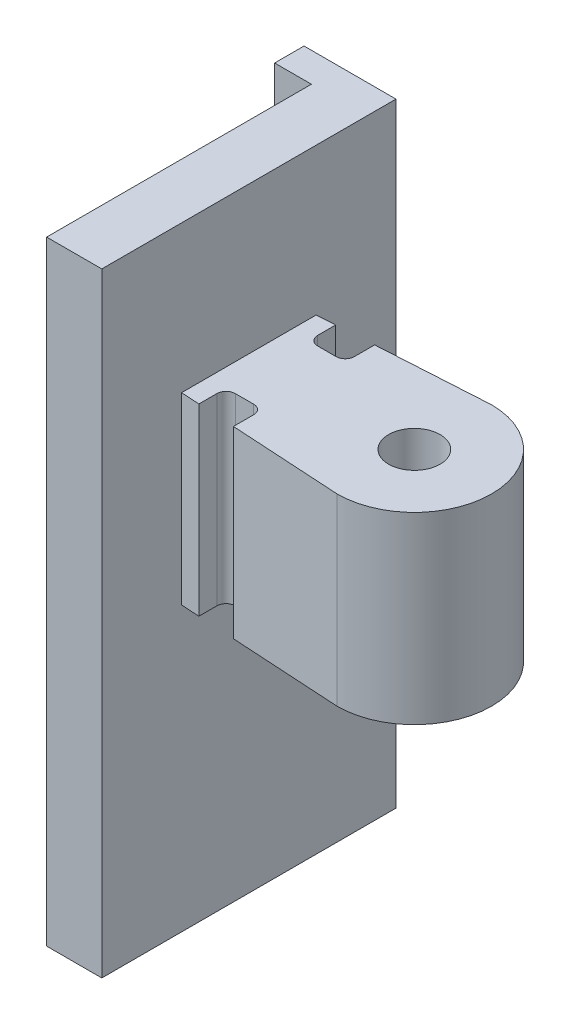
ISO-10303-21;
HEADER;
FILE_DESCRIPTION(('STEP AP214'),'2;1');
FILE_NAME('part.step','',(''),(''),'','','');
FILE_SCHEMA(('AUTOMOTIVE_DESIGN { 1 0 10303 214 1 1 1 1 }'));
ENDSEC;
DATA;
#1=APPLICATION_CONTEXT('core data for automotive mechanical design processes');
#2=APPLICATION_PROTOCOL_DEFINITION('international standard','automotive_design',2000,#1);
#3=PRODUCT_CONTEXT('',#1,'mechanical');
#4=PRODUCT('Part','Part','',(#3));
#5=PRODUCT_RELATED_PRODUCT_CATEGORY('part','',(#4));
#6=PRODUCT_DEFINITION_FORMATION('','',#4);
#7=PRODUCT_DEFINITION_CONTEXT('part definition',#1,'design');
#8=PRODUCT_DEFINITION('design','',#6,#7);
#9=PRODUCT_DEFINITION_SHAPE('','',#8);
#10=(LENGTH_UNIT() NAMED_UNIT(*) SI_UNIT(.MILLI.,.METRE.));
#11=(NAMED_UNIT(*) PLANE_ANGLE_UNIT() SI_UNIT($,.RADIAN.));
#12=(NAMED_UNIT(*) SI_UNIT($,.STERADIAN.) SOLID_ANGLE_UNIT());
#13=UNCERTAINTY_MEASURE_WITH_UNIT(LENGTH_MEASURE(1.E-05),#10,'distance_accuracy_value','');
#14=(GEOMETRIC_REPRESENTATION_CONTEXT(3) GLOBAL_UNCERTAINTY_ASSIGNED_CONTEXT((#13)) GLOBAL_UNIT_ASSIGNED_CONTEXT((#10,
#11,#12)) REPRESENTATION_CONTEXT('',''));
#15=CARTESIAN_POINT('',(0.,0.,0.));
#16=DIRECTION('',(0.,0.,1.));
#17=DIRECTION('',(1.,0.,0.));
#18=AXIS2_PLACEMENT_3D('',#15,#16,#17);
#19=CARTESIAN_POINT('',(-2.25000000000002,0.,0.));
#20=DIRECTION('',(-1.,0.,0.));
#21=DIRECTION('',(0.,0.,1.));
#22=AXIS2_PLACEMENT_3D('',#19,#20,#21);
#23=PLANE('',#22);
#24=DIRECTION('',(0.,-1.,0.));
#25=VECTOR('',#24,1.);
#26=CARTESIAN_POINT('',(-2.25000000000002,4.5,-2.));
#27=LINE('',#26,#25);
#28=CARTESIAN_POINT('',(-2.25000000000002,4.5,-2.));
#29=VERTEX_POINT('',#28);
#30=CARTESIAN_POINT('',(-2.25000000000002,-3.85,-2.));
#31=VERTEX_POINT('',#30);
#32=EDGE_CURVE('E191',#29,#31,#27,.T.);
#33=ORIENTED_EDGE('',*,*,#32,.F.);
#34=DIRECTION('',(0.,0.,-1.));
#35=VECTOR('',#34,1.);
#36=CARTESIAN_POINT('',(-2.25000000000002,4.5,-2.));
#37=LINE('',#36,#35);
#38=CARTESIAN_POINT('',(-2.25000000000002,4.5,2.));
#39=VERTEX_POINT('',#38);
#40=EDGE_CURVE('E196',#39,#29,#37,.T.);
#41=ORIENTED_EDGE('',*,*,#40,.F.);
#42=DIRECTION('',(0.,1.,0.));
#43=VECTOR('',#42,1.);
#44=CARTESIAN_POINT('',(-2.25000000000002,4.5,2.));
#45=LINE('',#44,#43);
#46=CARTESIAN_POINT('',(-2.25000000000002,-3.85,2.));
#47=VERTEX_POINT('',#46);
#48=EDGE_CURVE('E231',#47,#39,#45,.T.);
#49=ORIENTED_EDGE('',*,*,#48,.F.);
#50=DIRECTION('',(0.,0.,1.));
#51=VECTOR('',#50,1.);
#52=CARTESIAN_POINT('',(-2.25000000000002,-3.85,-2.));
#53=LINE('',#52,#51);
#54=EDGE_CURVE('E229',#31,#47,#53,.T.);
#55=ORIENTED_EDGE('',*,*,#54,.F.);
#56=EDGE_LOOP('',(#33,#41,#49,#55));
#57=FACE_BOUND('',#56,.T.);
#58=DIRECTION('',(0.,1.,0.));
#59=VECTOR('',#58,1.);
#60=CARTESIAN_POINT('',(-2.25000000000002,2.5,0.915));
#61=LINE('',#60,#59);
#62=CARTESIAN_POINT('',(-2.25000000000002,0.,0.915));
#63=VERTEX_POINT('',#62);
#64=CARTESIAN_POINT('',(-2.25000000000002,2.5,0.915));
#65=VERTEX_POINT('',#64);
#66=EDGE_CURVE('E242',#63,#65,#61,.T.);
#67=ORIENTED_EDGE('',*,*,#66,.T.);
#68=DIRECTION('',(0.,0.,-1.));
#69=VECTOR('',#68,1.);
#70=CARTESIAN_POINT('',(-2.25000000000002,2.5,0.));
#71=LINE('',#70,#69);
#72=CARTESIAN_POINT('',(-2.25000000000002,2.5,-0.915));
#73=VERTEX_POINT('',#72);
#74=EDGE_CURVE('E244',#65,#73,#71,.T.);
#75=ORIENTED_EDGE('',*,*,#74,.T.);
#76=DIRECTION('',(0.,1.,0.));
#77=VECTOR('',#76,1.);
#78=CARTESIAN_POINT('',(-2.25000000000002,2.5,-0.915));
#79=LINE('',#78,#77);
#80=CARTESIAN_POINT('',(-2.25000000000002,0.,-0.915));
#81=VERTEX_POINT('',#80);
#82=EDGE_CURVE('E60',#81,#73,#79,.T.);
#83=ORIENTED_EDGE('',*,*,#82,.F.);
#84=DIRECTION('',(0.,0.,-1.));
#85=VECTOR('',#84,1.);
#86=CARTESIAN_POINT('',(-2.25000000000002,0.,0.));
#87=LINE('',#86,#85);
#88=EDGE_CURVE('E11',#63,#81,#87,.T.);
#89=ORIENTED_EDGE('',*,*,#88,.F.);
#90=EDGE_LOOP('',(#67,#75,#83,#89));
#91=FACE_BOUND('',#90,.T.);
#92=ADVANCED_FACE('F37',(#57,#91),#23,.F.);
#93=CARTESIAN_POINT('',(-2.25000000000002,4.5,-2.));
#94=DIRECTION('',(0.,0.,-1.));
#95=DIRECTION('',(0.,1.,0.));
#96=AXIS2_PLACEMENT_3D('',#93,#94,#95);
#97=PLANE('',#96);
#98=DIRECTION('',(-1.,0.,0.));
#99=VECTOR('',#98,1.);
#100=CARTESIAN_POINT('',(-2.25000000000002,-3.85,-2.));
#101=LINE('',#100,#99);
#102=CARTESIAN_POINT('',(-3.50000000000002,-3.85,-2.));
#103=VERTEX_POINT('',#102);
#104=EDGE_CURVE('E185',#31,#103,#101,.T.);
#105=ORIENTED_EDGE('',*,*,#104,.T.);
#106=DIRECTION('',(0.,-1.,0.));
#107=VECTOR('',#106,1.);
#108=CARTESIAN_POINT('',(-3.50000000000002,-3.85,-2.));
#109=LINE('',#108,#107);
#110=CARTESIAN_POINT('',(-3.50000000000002,4.5,-2.));
#111=VERTEX_POINT('',#110);
#112=EDGE_CURVE('E189',#111,#103,#109,.T.);
#113=ORIENTED_EDGE('',*,*,#112,.F.);
#114=DIRECTION('',(-1.,0.,0.));
#115=VECTOR('',#114,1.);
#116=CARTESIAN_POINT('',(-2.25000000000002,4.5,-2.));
#117=LINE('',#116,#115);
#118=EDGE_CURVE('E236',#29,#111,#117,.T.);
#119=ORIENTED_EDGE('',*,*,#118,.F.);
#120=ORIENTED_EDGE('',*,*,#32,.T.);
#121=EDGE_LOOP('',(#105,#113,#119,#120));
#122=FACE_BOUND('',#121,.T.);
#123=ADVANCED_FACE('F187',(#122),#97,.T.);
#124=CARTESIAN_POINT('',(-2.25000000000002,4.5,-2.));
#125=DIRECTION('',(0.,1.,0.));
#126=DIRECTION('',(0.,0.,1.));
#127=AXIS2_PLACEMENT_3D('',#124,#125,#126);
#128=PLANE('',#127);
#129=ORIENTED_EDGE('',*,*,#118,.T.);
#130=DIRECTION('',(0.,0.,-1.));
#131=VECTOR('',#130,1.);
#132=CARTESIAN_POINT('',(-3.50000000000002,4.5,-2.));
#133=LINE('',#132,#131);
#134=CARTESIAN_POINT('',(-3.50000000000002,4.5,-1.6));
#135=VERTEX_POINT('',#134);
#136=EDGE_CURVE('E211',#135,#111,#133,.T.);
#137=ORIENTED_EDGE('',*,*,#136,.F.);
#138=DIRECTION('',(1.,0.,0.));
#139=VECTOR('',#138,1.);
#140=CARTESIAN_POINT('',(-3.50000000000002,4.5,-1.6));
#141=LINE('',#140,#139);
#142=CARTESIAN_POINT('',(-3.00000000000002,4.5,-1.6));
#143=VERTEX_POINT('',#142);
#144=EDGE_CURVE('E216',#135,#143,#141,.T.);
#145=ORIENTED_EDGE('',*,*,#144,.T.);
#146=DIRECTION('',(0.,0.,-1.));
#147=VECTOR('',#146,1.);
#148=CARTESIAN_POINT('',(-3.00000000000002,4.5,-2.));
#149=LINE('',#148,#147);
#150=CARTESIAN_POINT('',(-3.00000000000002,4.5,2.));
#151=VERTEX_POINT('',#150);
#152=EDGE_CURVE('E226',#151,#143,#149,.T.);
#153=ORIENTED_EDGE('',*,*,#152,.F.);
#154=DIRECTION('',(-1.,0.,0.));
#155=VECTOR('',#154,1.);
#156=CARTESIAN_POINT('',(-2.25000000000002,4.5,2.));
#157=LINE('',#156,#155);
#158=EDGE_CURVE('E238',#39,#151,#157,.T.);
#159=ORIENTED_EDGE('',*,*,#158,.F.);
#160=ORIENTED_EDGE('',*,*,#40,.T.);
#161=EDGE_LOOP('',(#129,#137,#145,#153,#159,#160));
#162=FACE_BOUND('',#161,.T.);
#163=ADVANCED_FACE('F438',(#162),#128,.T.);
#164=CARTESIAN_POINT('',(-2.25000000000002,4.5,2.));
#165=DIRECTION('',(0.,0.,1.));
#166=DIRECTION('',(0.,-1.,0.));
#167=AXIS2_PLACEMENT_3D('',#164,#165,#166);
#168=PLANE('',#167);
#169=ORIENTED_EDGE('',*,*,#158,.T.);
#170=DIRECTION('',(0.,1.,0.));
#171=VECTOR('',#170,1.);
#172=CARTESIAN_POINT('',(-3.00000000000002,4.5,2.));
#173=LINE('',#172,#171);
#174=CARTESIAN_POINT('',(-3.00000000000002,-3.85,2.));
#175=VERTEX_POINT('',#174);
#176=EDGE_CURVE('E223',#175,#151,#173,.T.);
#177=ORIENTED_EDGE('',*,*,#176,.F.);
#178=DIRECTION('',(-1.,0.,0.));
#179=VECTOR('',#178,1.);
#180=CARTESIAN_POINT('',(-2.25000000000002,-3.85,2.));
#181=LINE('',#180,#179);
#182=EDGE_CURVE('E195',#47,#175,#181,.T.);
#183=ORIENTED_EDGE('',*,*,#182,.F.);
#184=ORIENTED_EDGE('',*,*,#48,.T.);
#185=EDGE_LOOP('',(#169,#177,#183,#184));
#186=FACE_BOUND('',#185,.T.);
#187=ADVANCED_FACE('F446',(#186),#168,.T.);
#188=CARTESIAN_POINT('',(-2.25000000000002,-3.85,-2.));
#189=DIRECTION('',(0.,-1.,0.));
#190=DIRECTION('',(0.,0.,-1.));
#191=AXIS2_PLACEMENT_3D('',#188,#189,#190);
#192=PLANE('',#191);
#193=ORIENTED_EDGE('',*,*,#182,.T.);
#194=DIRECTION('',(0.,0.,1.));
#195=VECTOR('',#194,1.);
#196=CARTESIAN_POINT('',(-3.00000000000002,-3.85,-2.));
#197=LINE('',#196,#195);
#198=CARTESIAN_POINT('',(-3.00000000000002,-3.85,-1.6));
#199=VERTEX_POINT('',#198);
#200=EDGE_CURVE('E221',#199,#175,#197,.T.);
#201=ORIENTED_EDGE('',*,*,#200,.F.);
#202=DIRECTION('',(1.,0.,0.));
#203=VECTOR('',#202,1.);
#204=CARTESIAN_POINT('',(-3.50000000000002,-3.85,-1.6));
#205=LINE('',#204,#203);
#206=CARTESIAN_POINT('',(-3.50000000000002,-3.85,-1.6));
#207=VERTEX_POINT('',#206);
#208=EDGE_CURVE('E203',#207,#199,#205,.T.);
#209=ORIENTED_EDGE('',*,*,#208,.F.);
#210=DIRECTION('',(0.,0.,1.));
#211=VECTOR('',#210,1.);
#212=CARTESIAN_POINT('',(-3.50000000000002,-3.85,-1.6));
#213=LINE('',#212,#211);
#214=EDGE_CURVE('E199',#103,#207,#213,.T.);
#215=ORIENTED_EDGE('',*,*,#214,.F.);
#216=ORIENTED_EDGE('',*,*,#104,.F.);
#217=ORIENTED_EDGE('',*,*,#54,.T.);
#218=EDGE_LOOP('',(#193,#201,#209,#215,#216,#217));
#219=FACE_BOUND('',#218,.T.);
#220=ADVANCED_FACE('F201',(#219),#192,.T.);
#221=CARTESIAN_POINT('',(-3.00000000000002,0.,0.));
#222=DIRECTION('',(-1.,0.,0.));
#223=DIRECTION('',(0.,0.,1.));
#224=AXIS2_PLACEMENT_3D('',#221,#222,#223);
#225=PLANE('',#224);
#226=DIRECTION('',(0.,1.,0.));
#227=VECTOR('',#226,1.);
#228=CARTESIAN_POINT('',(-3.00000000000002,4.5,-1.6));
#229=LINE('',#228,#227);
#230=EDGE_CURVE('E52',#199,#143,#229,.T.);
#231=ORIENTED_EDGE('',*,*,#230,.F.);
#232=ORIENTED_EDGE('',*,*,#200,.T.);
#233=ORIENTED_EDGE('',*,*,#176,.T.);
#234=ORIENTED_EDGE('',*,*,#152,.T.);
#235=EDGE_LOOP('',(#231,#232,#233,#234));
#236=FACE_BOUND('',#235,.T.);
#237=ADVANCED_FACE('F442',(#236),#225,.T.);
#238=CARTESIAN_POINT('',(-2.50000000000002,2.5,0.9));
#239=DIRECTION('',(0.0598922907279451,0.,-0.998204845465779));
#240=DIRECTION('',(-0.998204845465779,0.,-0.0598922907279451));
#241=AXIS2_PLACEMENT_3D('',#238,#239,#240);
#242=PLANE('',#241);
#243=ORIENTED_EDGE('',*,*,#66,.F.);
#244=DIRECTION('',(0.998204845465779,0.,0.0598922907279451));
#245=VECTOR('',#244,1.);
#246=CARTESIAN_POINT('',(-2.50000000000002,0.,0.9));
#247=LINE('',#246,#245);
#248=CARTESIAN_POINT('',(-2.,0.,0.93));
#249=VERTEX_POINT('',#248);
#250=EDGE_CURVE('E250',#63,#249,#247,.T.);
#251=ORIENTED_EDGE('',*,*,#250,.T.);
#252=DIRECTION('',(0.,-1.,0.));
#253=VECTOR('',#252,1.);
#254=CARTESIAN_POINT('',(-2.,2.5,0.93));
#255=LINE('',#254,#253);
#256=CARTESIAN_POINT('',(-2.,2.5,0.93));
#257=VERTEX_POINT('',#256);
#258=EDGE_CURVE('E324',#257,#249,#255,.T.);
#259=ORIENTED_EDGE('',*,*,#258,.F.);
#260=DIRECTION('',(0.998204845465779,0.,0.0598922907279451));
#261=VECTOR('',#260,1.);
#262=CARTESIAN_POINT('',(-2.50000000000002,2.5,0.9));
#263=LINE('',#262,#261);
#264=EDGE_CURVE('E253',#65,#257,#263,.T.);
#265=ORIENTED_EDGE('',*,*,#264,.F.);
#266=EDGE_LOOP('',(#243,#251,#259,#265));
#267=FACE_BOUND('',#266,.T.);
#268=ADVANCED_FACE('F428',(#267),#242,.F.);
#269=CARTESIAN_POINT('',(-2.50000000000002,2.5,-0.9));
#270=DIRECTION('',(-0.0598922907279451,0.,-0.998204845465779));
#271=DIRECTION('',(-0.998204845465779,0.,0.0598922907279451));
#272=AXIS2_PLACEMENT_3D('',#269,#270,#271);
#273=PLANE('',#272);
#274=DIRECTION('',(0.998204845465779,0.,-0.0598922907279451));
#275=VECTOR('',#274,1.);
#276=CARTESIAN_POINT('',(-2.50000000000002,0.,-0.9));
#277=LINE('',#276,#275);
#278=CARTESIAN_POINT('',(-2.,0.,-0.93));
#279=VERTEX_POINT('',#278);
#280=EDGE_CURVE('E256',#81,#279,#277,.T.);
#281=ORIENTED_EDGE('',*,*,#280,.F.);
#282=ORIENTED_EDGE('',*,*,#82,.T.);
#283=DIRECTION('',(0.998204845465779,0.,-0.0598922907279451));
#284=VECTOR('',#283,1.);
#285=CARTESIAN_POINT('',(-2.50000000000002,2.5,-0.9));
#286=LINE('',#285,#284);
#287=CARTESIAN_POINT('',(-2.,2.5,-0.93));
#288=VERTEX_POINT('',#287);
#289=EDGE_CURVE('E282',#73,#288,#286,.T.);
#290=ORIENTED_EDGE('',*,*,#289,.T.);
#291=DIRECTION('',(0.,-1.,0.));
#292=VECTOR('',#291,1.);
#293=CARTESIAN_POINT('',(-2.,2.5,-0.93));
#294=LINE('',#293,#292);
#295=EDGE_CURVE('E284',#288,#279,#294,.T.);
#296=ORIENTED_EDGE('',*,*,#295,.T.);
#297=EDGE_LOOP('',(#281,#282,#290,#296));
#298=FACE_BOUND('',#297,.T.);
#299=ADVANCED_FACE('F431',(#298),#273,.T.);
#300=CARTESIAN_POINT('',(0.,2.5,0.));
#301=DIRECTION('',(0.,-1.,0.));
#302=DIRECTION('',(0.,0.,-1.));
#303=AXIS2_PLACEMENT_3D('',#300,#301,#302);
#304=PLANE('',#303);
#305=CARTESIAN_POINT('',(0.,2.5,0.));
#306=DIRECTION('',(0.,1.,0.));
#307=DIRECTION('',(0.,0.,1.));
#308=AXIS2_PLACEMENT_3D('',#305,#306,#307);
#309=CIRCLE('',#308,0.35);
#310=CARTESIAN_POINT('',(0.,2.5,0.35));
#311=VERTEX_POINT('',#310);
#312=EDGE_CURVE('E246',#311,#311,#309,.T.);
#313=ORIENTED_EDGE('',*,*,#312,.F.);
#314=EDGE_LOOP('',(#313));
#315=FACE_BOUND('',#314,.T.);
#316=ORIENTED_EDGE('',*,*,#74,.F.);
#317=ORIENTED_EDGE('',*,*,#264,.T.);
#318=DIRECTION('',(0.,0.,-1.));
#319=VECTOR('',#318,1.);
#320=CARTESIAN_POINT('',(-2.,2.5,0.93));
#321=LINE('',#320,#319);
#322=CARTESIAN_POINT('',(-2.,2.5,0.685));
#323=VERTEX_POINT('',#322);
#324=EDGE_CURVE('E255',#257,#323,#321,.T.);
#325=ORIENTED_EDGE('',*,*,#324,.T.);
#326=CARTESIAN_POINT('',(-1.875,2.5,0.685));
#327=DIRECTION('',(0.,-1.,0.));
#328=DIRECTION('',(0.,0.,-1.));
#329=AXIS2_PLACEMENT_3D('',#326,#327,#328);
#330=CIRCLE('',#329,0.125);
#331=CARTESIAN_POINT('',(-1.875,2.5,0.56));
#332=VERTEX_POINT('',#331);
#333=EDGE_CURVE('E349',#323,#332,#330,.T.);
#334=ORIENTED_EDGE('',*,*,#333,.T.);
#335=DIRECTION('',(-1.,0.,0.));
#336=VECTOR('',#335,1.);
#337=CARTESIAN_POINT('',(-1.5,2.5,0.56));
#338=LINE('',#337,#336);
#339=CARTESIAN_POINT('',(-1.625,2.5,0.56));
#340=VERTEX_POINT('',#339);
#341=EDGE_CURVE('E259',#340,#332,#338,.T.);
#342=ORIENTED_EDGE('',*,*,#341,.F.);
#343=CARTESIAN_POINT('',(-1.625,2.5,0.685));
#344=DIRECTION('',(0.,-1.,0.));
#345=DIRECTION('',(0.,0.,-1.));
#346=AXIS2_PLACEMENT_3D('',#343,#344,#345);
#347=CIRCLE('',#346,0.125);
#348=CARTESIAN_POINT('',(-1.5,2.5,0.685));
#349=VERTEX_POINT('',#348);
#350=EDGE_CURVE('E353',#340,#349,#347,.T.);
#351=ORIENTED_EDGE('',*,*,#350,.T.);
#352=DIRECTION('',(0.,0.,1.));
#353=VECTOR('',#352,1.);
#354=CARTESIAN_POINT('',(-1.5,2.5,0.56));
#355=LINE('',#354,#353);
#356=CARTESIAN_POINT('',(-1.5,2.5,0.96));
#357=VERTEX_POINT('',#356);
#358=EDGE_CURVE('E262',#349,#357,#355,.T.);
#359=ORIENTED_EDGE('',*,*,#358,.T.);
#360=DIRECTION('',(-0.998204845465779,0.,-0.0598922907279466));
#361=VECTOR('',#360,1.);
#362=CARTESIAN_POINT('',(0.,2.5,1.05));
#363=LINE('',#362,#361);
#364=CARTESIAN_POINT('',(0.,2.5,1.05));
#365=VERTEX_POINT('',#364);
#366=EDGE_CURVE('E264',#365,#357,#363,.T.);
#367=ORIENTED_EDGE('',*,*,#366,.F.);
#368=CARTESIAN_POINT('',(0.,2.5,0.));
#369=DIRECTION('',(0.,-1.,0.));
#370=DIRECTION('',(0.,0.,-1.));
#371=AXIS2_PLACEMENT_3D('',#368,#369,#370);
#372=CIRCLE('',#371,1.05);
#373=CARTESIAN_POINT('',(0.,2.5,-1.05));
#374=VERTEX_POINT('',#373);
#375=EDGE_CURVE('E267',#374,#365,#372,.T.);
#376=ORIENTED_EDGE('',*,*,#375,.F.);
#377=DIRECTION('',(0.998204845465779,0.,-0.0598922907279466));
#378=VECTOR('',#377,1.);
#379=CARTESIAN_POINT('',(-1.5,2.5,-0.96));
#380=LINE('',#379,#378);
#381=CARTESIAN_POINT('',(-1.5,2.5,-0.96));
#382=VERTEX_POINT('',#381);
#383=EDGE_CURVE('E270',#382,#374,#380,.T.);
#384=ORIENTED_EDGE('',*,*,#383,.F.);
#385=DIRECTION('',(0.,0.,1.));
#386=VECTOR('',#385,1.);
#387=CARTESIAN_POINT('',(-1.5,2.5,-0.96));
#388=LINE('',#387,#386);
#389=CARTESIAN_POINT('',(-1.5,2.5,-0.685));
#390=VERTEX_POINT('',#389);
#391=EDGE_CURVE('E273',#382,#390,#388,.T.);
#392=ORIENTED_EDGE('',*,*,#391,.T.);
#393=CARTESIAN_POINT('',(-1.625,2.5,-0.685));
#394=DIRECTION('',(0.,-1.,0.));
#395=DIRECTION('',(0.,0.,-1.));
#396=AXIS2_PLACEMENT_3D('',#393,#394,#395);
#397=CIRCLE('',#396,0.125);
#398=CARTESIAN_POINT('',(-1.625,2.5,-0.56));
#399=VERTEX_POINT('',#398);
#400=EDGE_CURVE('E357',#390,#399,#397,.T.);
#401=ORIENTED_EDGE('',*,*,#400,.T.);
#402=DIRECTION('',(1.,0.,0.));
#403=VECTOR('',#402,1.);
#404=CARTESIAN_POINT('',(-2.,2.5,-0.56));
#405=LINE('',#404,#403);
#406=CARTESIAN_POINT('',(-1.875,2.5,-0.56));
#407=VERTEX_POINT('',#406);
#408=EDGE_CURVE('E276',#407,#399,#405,.T.);
#409=ORIENTED_EDGE('',*,*,#408,.F.);
#410=CARTESIAN_POINT('',(-1.875,2.5,-0.685));
#411=DIRECTION('',(0.,-1.,0.));
#412=DIRECTION('',(0.,0.,-1.));
#413=AXIS2_PLACEMENT_3D('',#410,#411,#412);
#414=CIRCLE('',#413,0.125);
#415=CARTESIAN_POINT('',(-2.,2.5,-0.685));
#416=VERTEX_POINT('',#415);
#417=EDGE_CURVE('E45',#407,#416,#414,.T.);
#418=ORIENTED_EDGE('',*,*,#417,.T.);
#419=DIRECTION('',(0.,0.,1.));
#420=VECTOR('',#419,1.);
#421=CARTESIAN_POINT('',(-2.,2.5,-0.93));
#422=LINE('',#421,#420);
#423=EDGE_CURVE('E279',#288,#416,#422,.T.);
#424=ORIENTED_EDGE('',*,*,#423,.F.);
#425=ORIENTED_EDGE('',*,*,#289,.F.);
#426=EDGE_LOOP('',(#316,#317,#325,#334,#342,#351,#359,#367,#376,#384,#392,#401,#409,#418,#424,#425));
#427=FACE_BOUND('',#426,.T.);
#428=ADVANCED_FACE('F365',(#315,#427),#304,.F.);
#429=CARTESIAN_POINT('',(0.,0.,0.));
#430=DIRECTION('',(0.,-1.,0.));
#431=DIRECTION('',(0.,0.,-1.));
#432=AXIS2_PLACEMENT_3D('',#429,#430,#431);
#433=PLANE('',#432);
#434=CARTESIAN_POINT('',(0.,0.,0.));
#435=DIRECTION('',(0.,1.,0.));
#436=DIRECTION('',(0.,0.,1.));
#437=AXIS2_PLACEMENT_3D('',#434,#435,#436);
#438=CIRCLE('',#437,0.35);
#439=CARTESIAN_POINT('',(0.,0.,0.35));
#440=VERTEX_POINT('',#439);
#441=EDGE_CURVE('E247',#440,#440,#438,.T.);
#442=ORIENTED_EDGE('',*,*,#441,.T.);
#443=EDGE_LOOP('',(#442));
#444=FACE_BOUND('',#443,.T.);
#445=ORIENTED_EDGE('',*,*,#250,.F.);
#446=ORIENTED_EDGE('',*,*,#88,.T.);
#447=ORIENTED_EDGE('',*,*,#280,.T.);
#448=DIRECTION('',(0.,0.,1.));
#449=VECTOR('',#448,1.);
#450=CARTESIAN_POINT('',(-2.,0.,-0.93));
#451=LINE('',#450,#449);
#452=CARTESIAN_POINT('',(-2.,0.,-0.685));
#453=VERTEX_POINT('',#452);
#454=EDGE_CURVE('E309',#279,#453,#451,.T.);
#455=ORIENTED_EDGE('',*,*,#454,.T.);
#456=CARTESIAN_POINT('',(-1.875,0.,-0.685));
#457=DIRECTION('',(0.,-1.,0.));
#458=DIRECTION('',(0.,0.,-1.));
#459=AXIS2_PLACEMENT_3D('',#456,#457,#458);
#460=CIRCLE('',#459,0.125);
#461=CARTESIAN_POINT('',(-1.875,0.,-0.56));
#462=VERTEX_POINT('',#461);
#463=EDGE_CURVE('E359',#453,#462,#460,.F.);
#464=ORIENTED_EDGE('',*,*,#463,.T.);
#465=DIRECTION('',(1.,0.,0.));
#466=VECTOR('',#465,1.);
#467=CARTESIAN_POINT('',(-2.,0.,-0.56));
#468=LINE('',#467,#466);
#469=CARTESIAN_POINT('',(-1.625,0.,-0.56));
#470=VERTEX_POINT('',#469);
#471=EDGE_CURVE('E306',#462,#470,#468,.T.);
#472=ORIENTED_EDGE('',*,*,#471,.T.);
#473=CARTESIAN_POINT('',(-1.625,0.,-0.685));
#474=DIRECTION('',(0.,-1.,0.));
#475=DIRECTION('',(0.,0.,-1.));
#476=AXIS2_PLACEMENT_3D('',#473,#474,#475);
#477=CIRCLE('',#476,0.125);
#478=CARTESIAN_POINT('',(-1.5,0.,-0.685));
#479=VERTEX_POINT('',#478);
#480=EDGE_CURVE('E355',#470,#479,#477,.F.);
#481=ORIENTED_EDGE('',*,*,#480,.T.);
#482=DIRECTION('',(0.,0.,1.));
#483=VECTOR('',#482,1.);
#484=CARTESIAN_POINT('',(-1.5,0.,-0.96));
#485=LINE('',#484,#483);
#486=CARTESIAN_POINT('',(-1.5,0.,-0.96));
#487=VERTEX_POINT('',#486);
#488=EDGE_CURVE('E303',#487,#479,#485,.T.);
#489=ORIENTED_EDGE('',*,*,#488,.F.);
#490=DIRECTION('',(0.998204845465779,0.,-0.0598922907279466));
#491=VECTOR('',#490,1.);
#492=CARTESIAN_POINT('',(-1.5,0.,-0.96));
#493=LINE('',#492,#491);
#494=CARTESIAN_POINT('',(0.,0.,-1.05));
#495=VERTEX_POINT('',#494);
#496=EDGE_CURVE('E300',#487,#495,#493,.T.);
#497=ORIENTED_EDGE('',*,*,#496,.T.);
#498=CARTESIAN_POINT('',(0.,0.,0.));
#499=DIRECTION('',(0.,-1.,0.));
#500=DIRECTION('',(0.,0.,-1.));
#501=AXIS2_PLACEMENT_3D('',#498,#499,#500);
#502=CIRCLE('',#501,1.05);
#503=CARTESIAN_POINT('',(0.,0.,1.05));
#504=VERTEX_POINT('',#503);
#505=EDGE_CURVE('E297',#495,#504,#502,.T.);
#506=ORIENTED_EDGE('',*,*,#505,.T.);
#507=DIRECTION('',(-0.998204845465779,0.,-0.0598922907279466));
#508=VECTOR('',#507,1.);
#509=CARTESIAN_POINT('',(0.,0.,1.05));
#510=LINE('',#509,#508);
#511=CARTESIAN_POINT('',(-1.5,0.,0.96));
#512=VERTEX_POINT('',#511);
#513=EDGE_CURVE('E294',#504,#512,#510,.T.);
#514=ORIENTED_EDGE('',*,*,#513,.T.);
#515=DIRECTION('',(0.,0.,1.));
#516=VECTOR('',#515,1.);
#517=CARTESIAN_POINT('',(-1.5,0.,0.56));
#518=LINE('',#517,#516);
#519=CARTESIAN_POINT('',(-1.5,0.,0.685));
#520=VERTEX_POINT('',#519);
#521=EDGE_CURVE('E292',#520,#512,#518,.T.);
#522=ORIENTED_EDGE('',*,*,#521,.F.);
#523=CARTESIAN_POINT('',(-1.625,0.,0.685));
#524=DIRECTION('',(0.,-1.,0.));
#525=DIRECTION('',(0.,0.,-1.));
#526=AXIS2_PLACEMENT_3D('',#523,#524,#525);
#527=CIRCLE('',#526,0.125);
#528=CARTESIAN_POINT('',(-1.625,0.,0.56));
#529=VERTEX_POINT('',#528);
#530=EDGE_CURVE('E351',#520,#529,#527,.F.);
#531=ORIENTED_EDGE('',*,*,#530,.T.);
#532=DIRECTION('',(-1.,0.,0.));
#533=VECTOR('',#532,1.);
#534=CARTESIAN_POINT('',(-1.5,0.,0.56));
#535=LINE('',#534,#533);
#536=CARTESIAN_POINT('',(-1.875,0.,0.56));
#537=VERTEX_POINT('',#536);
#538=EDGE_CURVE('E289',#529,#537,#535,.T.);
#539=ORIENTED_EDGE('',*,*,#538,.T.);
#540=CARTESIAN_POINT('',(-1.875,0.,0.685));
#541=DIRECTION('',(0.,-1.,0.));
#542=DIRECTION('',(0.,0.,-1.));
#543=AXIS2_PLACEMENT_3D('',#540,#541,#542);
#544=CIRCLE('',#543,0.125);
#545=CARTESIAN_POINT('',(-2.,0.,0.685));
#546=VERTEX_POINT('',#545);
#547=EDGE_CURVE('E347',#537,#546,#544,.F.);
#548=ORIENTED_EDGE('',*,*,#547,.T.);
#549=DIRECTION('',(0.,0.,-1.));
#550=VECTOR('',#549,1.);
#551=CARTESIAN_POINT('',(-2.,0.,0.93));
#552=LINE('',#551,#550);
#553=EDGE_CURVE('E286',#249,#546,#552,.T.);
#554=ORIENTED_EDGE('',*,*,#553,.F.);
#555=EDGE_LOOP('',(#445,#446,#447,#455,#464,#472,#481,#489,#497,#506,#514,#522,#531,#539,#548,#554));
#556=FACE_BOUND('',#555,.T.);
#557=ADVANCED_FACE('F377',(#444,#556),#433,.T.);
#558=CARTESIAN_POINT('',(-2.,2.5,0.93));
#559=DIRECTION('',(-1.,0.,0.));
#560=DIRECTION('',(0.,0.,1.));
#561=AXIS2_PLACEMENT_3D('',#558,#559,#560);
#562=PLANE('',#561);
#563=ORIENTED_EDGE('',*,*,#553,.T.);
#564=DIRECTION('',(0.,-1.,0.));
#565=VECTOR('',#564,1.);
#566=CARTESIAN_POINT('',(-2.,2.5,0.685));
#567=LINE('',#566,#565);
#568=EDGE_CURVE('E332',#546,#323,#567,.F.);
#569=ORIENTED_EDGE('',*,*,#568,.T.);
#570=ORIENTED_EDGE('',*,*,#324,.F.);
#571=ORIENTED_EDGE('',*,*,#258,.T.);
#572=EDGE_LOOP('',(#563,#569,#570,#571));
#573=FACE_BOUND('',#572,.T.);
#574=ADVANCED_FACE('F422',(#573),#562,.F.);
#575=CARTESIAN_POINT('',(-1.5,2.5,0.56));
#576=DIRECTION('',(0.,0.,1.));
#577=DIRECTION('',(1.,0.,0.));
#578=AXIS2_PLACEMENT_3D('',#575,#576,#577);
#579=PLANE('',#578);
#580=ORIENTED_EDGE('',*,*,#341,.T.);
#581=DIRECTION('',(0.,-1.,0.));
#582=VECTOR('',#581,1.);
#583=CARTESIAN_POINT('',(-1.875,2.5,0.56));
#584=LINE('',#583,#582);
#585=EDGE_CURVE('E329',#332,#537,#584,.T.);
#586=ORIENTED_EDGE('',*,*,#585,.T.);
#587=ORIENTED_EDGE('',*,*,#538,.F.);
#588=DIRECTION('',(0.,-1.,0.));
#589=VECTOR('',#588,1.);
#590=CARTESIAN_POINT('',(-1.625,2.5,0.56));
#591=LINE('',#590,#589);
#592=EDGE_CURVE('E327',#529,#340,#591,.F.);
#593=ORIENTED_EDGE('',*,*,#592,.T.);
#594=EDGE_LOOP('',(#580,#586,#587,#593));
#595=FACE_BOUND('',#594,.T.);
#596=ADVANCED_FACE('F411',(#595),#579,.T.);
#597=CARTESIAN_POINT('',(-1.5,2.5,0.56));
#598=DIRECTION('',(1.,0.,0.));
#599=DIRECTION('',(0.,0.,-1.));
#600=AXIS2_PLACEMENT_3D('',#597,#598,#599);
#601=PLANE('',#600);
#602=ORIENTED_EDGE('',*,*,#358,.F.);
#603=DIRECTION('',(0.,-1.,0.));
#604=VECTOR('',#603,1.);
#605=CARTESIAN_POINT('',(-1.5,2.5,0.685));
#606=LINE('',#605,#604);
#607=EDGE_CURVE('E334',#349,#520,#606,.T.);
#608=ORIENTED_EDGE('',*,*,#607,.T.);
#609=ORIENTED_EDGE('',*,*,#521,.T.);
#610=DIRECTION('',(0.,-1.,0.));
#611=VECTOR('',#610,1.);
#612=CARTESIAN_POINT('',(-1.5,2.5,0.96));
#613=LINE('',#612,#611);
#614=EDGE_CURVE('E321',#357,#512,#613,.T.);
#615=ORIENTED_EDGE('',*,*,#614,.F.);
#616=EDGE_LOOP('',(#602,#608,#609,#615));
#617=FACE_BOUND('',#616,.T.);
#618=ADVANCED_FACE('F405',(#617),#601,.F.);
#619=CARTESIAN_POINT('',(0.,2.5,1.05));
#620=DIRECTION('',(-0.0598922907279466,0.,0.998204845465779));
#621=DIRECTION('',(0.998204845465779,0.,0.0598922907279466));
#622=AXIS2_PLACEMENT_3D('',#619,#620,#621);
#623=PLANE('',#622);
#624=ORIENTED_EDGE('',*,*,#513,.F.);
#625=DIRECTION('',(0.,-1.,0.));
#626=VECTOR('',#625,1.);
#627=CARTESIAN_POINT('',(0.,2.5,1.05));
#628=LINE('',#627,#626);
#629=EDGE_CURVE('E319',#365,#504,#628,.T.);
#630=ORIENTED_EDGE('',*,*,#629,.F.);
#631=ORIENTED_EDGE('',*,*,#366,.T.);
#632=ORIENTED_EDGE('',*,*,#614,.T.);
#633=EDGE_LOOP('',(#624,#630,#631,#632));
#634=FACE_BOUND('',#633,.T.);
#635=ADVANCED_FACE('F401',(#634),#623,.T.);
#636=CARTESIAN_POINT('',(0.,2.5,0.));
#637=DIRECTION('',(0.,-1.,0.));
#638=DIRECTION('',(0.,0.,-1.));
#639=AXIS2_PLACEMENT_3D('',#636,#637,#638);
#640=CYLINDRICAL_SURFACE('',#639,1.05);
#641=ORIENTED_EDGE('',*,*,#505,.F.);
#642=DIRECTION('',(0.,-1.,0.));
#643=VECTOR('',#642,1.);
#644=CARTESIAN_POINT('',(0.,2.5,-1.05));
#645=LINE('',#644,#643);
#646=EDGE_CURVE('E317',#374,#495,#645,.T.);
#647=ORIENTED_EDGE('',*,*,#646,.F.);
#648=ORIENTED_EDGE('',*,*,#375,.T.);
#649=ORIENTED_EDGE('',*,*,#629,.T.);
#650=EDGE_LOOP('',(#641,#647,#648,#649));
#651=FACE_BOUND('',#650,.T.);
#652=ADVANCED_FACE('F397',(#651),#640,.T.);
#653=CARTESIAN_POINT('',(-1.5,2.5,-0.96));
#654=DIRECTION('',(-0.0598922907279466,0.,-0.998204845465779));
#655=DIRECTION('',(-0.998204845465779,0.,0.0598922907279466));
#656=AXIS2_PLACEMENT_3D('',#653,#654,#655);
#657=PLANE('',#656);
#658=ORIENTED_EDGE('',*,*,#496,.F.);
#659=DIRECTION('',(0.,-1.,0.));
#660=VECTOR('',#659,1.);
#661=CARTESIAN_POINT('',(-1.5,2.5,-0.96));
#662=LINE('',#661,#660);
#663=EDGE_CURVE('E315',#382,#487,#662,.T.);
#664=ORIENTED_EDGE('',*,*,#663,.F.);
#665=ORIENTED_EDGE('',*,*,#383,.T.);
#666=ORIENTED_EDGE('',*,*,#646,.T.);
#667=EDGE_LOOP('',(#658,#664,#665,#666));
#668=FACE_BOUND('',#667,.T.);
#669=ADVANCED_FACE('F392',(#668),#657,.T.);
#670=CARTESIAN_POINT('',(-1.5,2.5,-0.96));
#671=DIRECTION('',(1.,0.,0.));
#672=DIRECTION('',(0.,0.,-1.));
#673=AXIS2_PLACEMENT_3D('',#670,#671,#672);
#674=PLANE('',#673);
#675=ORIENTED_EDGE('',*,*,#488,.T.);
#676=DIRECTION('',(0.,-1.,0.));
#677=VECTOR('',#676,1.);
#678=CARTESIAN_POINT('',(-1.5,2.5,-0.685));
#679=LINE('',#678,#677);
#680=EDGE_CURVE('E342',#479,#390,#679,.F.);
#681=ORIENTED_EDGE('',*,*,#680,.T.);
#682=ORIENTED_EDGE('',*,*,#391,.F.);
#683=ORIENTED_EDGE('',*,*,#663,.T.);
#684=EDGE_LOOP('',(#675,#681,#682,#683));
#685=FACE_BOUND('',#684,.T.);
#686=ADVANCED_FACE('F388',(#685),#674,.F.);
#687=CARTESIAN_POINT('',(-2.,2.5,-0.56));
#688=DIRECTION('',(0.,0.,-1.));
#689=DIRECTION('',(-1.,0.,0.));
#690=AXIS2_PLACEMENT_3D('',#687,#688,#689);
#691=PLANE('',#690);
#692=ORIENTED_EDGE('',*,*,#408,.T.);
#693=DIRECTION('',(0.,-1.,0.));
#694=VECTOR('',#693,1.);
#695=CARTESIAN_POINT('',(-1.625,2.5,-0.56));
#696=LINE('',#695,#694);
#697=EDGE_CURVE('E339',#399,#470,#696,.T.);
#698=ORIENTED_EDGE('',*,*,#697,.T.);
#699=ORIENTED_EDGE('',*,*,#471,.F.);
#700=DIRECTION('',(0.,-1.,0.));
#701=VECTOR('',#700,1.);
#702=CARTESIAN_POINT('',(-1.875,2.5,-0.56));
#703=LINE('',#702,#701);
#704=EDGE_CURVE('E337',#462,#407,#703,.F.);
#705=ORIENTED_EDGE('',*,*,#704,.T.);
#706=EDGE_LOOP('',(#692,#698,#699,#705));
#707=FACE_BOUND('',#706,.T.);
#708=ADVANCED_FACE('F379',(#707),#691,.T.);
#709=CARTESIAN_POINT('',(-2.,2.5,-0.93));
#710=DIRECTION('',(1.,0.,0.));
#711=DIRECTION('',(0.,0.,-1.));
#712=AXIS2_PLACEMENT_3D('',#709,#710,#711);
#713=PLANE('',#712);
#714=ORIENTED_EDGE('',*,*,#423,.T.);
#715=DIRECTION('',(0.,-1.,0.));
#716=VECTOR('',#715,1.);
#717=CARTESIAN_POINT('',(-2.,0.,-0.685));
#718=LINE('',#717,#716);
#719=EDGE_CURVE('E344',#416,#453,#718,.T.);
#720=ORIENTED_EDGE('',*,*,#719,.T.);
#721=ORIENTED_EDGE('',*,*,#454,.F.);
#722=ORIENTED_EDGE('',*,*,#295,.F.);
#723=EDGE_LOOP('',(#714,#720,#721,#722));
#724=FACE_BOUND('',#723,.T.);
#725=ADVANCED_FACE('F372',(#724),#713,.T.);
#726=CARTESIAN_POINT('',(0.,0.,0.));
#727=DIRECTION('',(0.,1.,0.));
#728=DIRECTION('',(0.,0.,1.));
#729=AXIS2_PLACEMENT_3D('',#726,#727,#728);
#730=CYLINDRICAL_SURFACE('',#729,0.35);
#731=ORIENTED_EDGE('',*,*,#441,.F.);
#732=EDGE_LOOP('',(#731));
#733=FACE_BOUND('',#732,.T.);
#734=ORIENTED_EDGE('',*,*,#312,.T.);
#735=EDGE_LOOP('',(#734));
#736=FACE_BOUND('',#735,.T.);
#737=ADVANCED_FACE('F453',(#733,#736),#730,.F.);
#738=CARTESIAN_POINT('',(-1.875,2.5,0.685));
#739=DIRECTION('',(0.,-1.,0.));
#740=DIRECTION('',(0.,0.,-1.));
#741=AXIS2_PLACEMENT_3D('',#738,#739,#740);
#742=CYLINDRICAL_SURFACE('',#741,0.125);
#743=ORIENTED_EDGE('',*,*,#333,.F.);
#744=ORIENTED_EDGE('',*,*,#568,.F.);
#745=ORIENTED_EDGE('',*,*,#547,.F.);
#746=ORIENTED_EDGE('',*,*,#585,.F.);
#747=EDGE_LOOP('',(#743,#744,#745,#746));
#748=FACE_BOUND('',#747,.T.);
#749=ADVANCED_FACE('F418',(#748),#742,.F.);
#750=CARTESIAN_POINT('',(-1.625,2.5,0.685));
#751=DIRECTION('',(0.,-1.,0.));
#752=DIRECTION('',(0.,0.,-1.));
#753=AXIS2_PLACEMENT_3D('',#750,#751,#752);
#754=CYLINDRICAL_SURFACE('',#753,0.125);
#755=ORIENTED_EDGE('',*,*,#350,.F.);
#756=ORIENTED_EDGE('',*,*,#592,.F.);
#757=ORIENTED_EDGE('',*,*,#530,.F.);
#758=ORIENTED_EDGE('',*,*,#607,.F.);
#759=EDGE_LOOP('',(#755,#756,#757,#758));
#760=FACE_BOUND('',#759,.T.);
#761=ADVANCED_FACE('F415',(#760),#754,.F.);
#762=CARTESIAN_POINT('',(-1.625,2.5,-0.685));
#763=DIRECTION('',(0.,-1.,0.));
#764=DIRECTION('',(0.,0.,-1.));
#765=AXIS2_PLACEMENT_3D('',#762,#763,#764);
#766=CYLINDRICAL_SURFACE('',#765,0.125);
#767=ORIENTED_EDGE('',*,*,#400,.F.);
#768=ORIENTED_EDGE('',*,*,#680,.F.);
#769=ORIENTED_EDGE('',*,*,#480,.F.);
#770=ORIENTED_EDGE('',*,*,#697,.F.);
#771=EDGE_LOOP('',(#767,#768,#769,#770));
#772=FACE_BOUND('',#771,.T.);
#773=ADVANCED_FACE('F383',(#772),#766,.F.);
#774=CARTESIAN_POINT('',(-1.875,2.5,-0.685));
#775=DIRECTION('',(0.,1.,0.));
#776=DIRECTION('',(0.,0.,1.));
#777=AXIS2_PLACEMENT_3D('',#774,#775,#776);
#778=CYLINDRICAL_SURFACE('',#777,0.125);
#779=ORIENTED_EDGE('',*,*,#417,.F.);
#780=ORIENTED_EDGE('',*,*,#704,.F.);
#781=ORIENTED_EDGE('',*,*,#463,.F.);
#782=ORIENTED_EDGE('',*,*,#719,.F.);
#783=EDGE_LOOP('',(#779,#780,#781,#782));
#784=FACE_BOUND('',#783,.T.);
#785=ADVANCED_FACE('F39',(#784),#778,.F.);
#786=CARTESIAN_POINT('',(-3.50000000000002,4.5,-1.6));
#787=DIRECTION('',(0.,0.,-1.));
#788=DIRECTION('',(0.,1.,0.));
#789=AXIS2_PLACEMENT_3D('',#786,#787,#788);
#790=PLANE('',#789);
#791=ORIENTED_EDGE('',*,*,#230,.T.);
#792=ORIENTED_EDGE('',*,*,#144,.F.);
#793=DIRECTION('',(0.,1.,0.));
#794=VECTOR('',#793,1.);
#795=CARTESIAN_POINT('',(-3.50000000000002,4.5,-1.6));
#796=LINE('',#795,#794);
#797=EDGE_CURVE('E206',#207,#135,#796,.T.);
#798=ORIENTED_EDGE('',*,*,#797,.F.);
#799=ORIENTED_EDGE('',*,*,#208,.T.);
#800=EDGE_LOOP('',(#791,#792,#798,#799));
#801=FACE_BOUND('',#800,.T.);
#802=ADVANCED_FACE('F492',(#801),#790,.F.);
#803=CARTESIAN_POINT('',(-3.50000000000002,0.,0.));
#804=DIRECTION('',(1.,0.,0.));
#805=DIRECTION('',(0.,0.,-1.));
#806=AXIS2_PLACEMENT_3D('',#803,#804,#805);
#807=PLANE('',#806);
#808=ORIENTED_EDGE('',*,*,#112,.T.);
#809=ORIENTED_EDGE('',*,*,#214,.T.);
#810=ORIENTED_EDGE('',*,*,#797,.T.);
#811=ORIENTED_EDGE('',*,*,#136,.T.);
#812=EDGE_LOOP('',(#808,#809,#810,#811));
#813=FACE_BOUND('',#812,.T.);
#814=ADVANCED_FACE('F209',(#813),#807,.F.);
#815=CLOSED_SHELL('',(#92,#123,#163,#187,#220,#237,#268,#299,#428,#557,#574,#596,#618,#635,#652,
#669,#686,#708,#725,#737,#749,#761,#773,#785,#802,#814));
#816=MANIFOLD_SOLID_BREP('B2',#815);
#817=ADVANCED_BREP_SHAPE_REPRESENTATION('',(#18,#816),#14);
#818=SHAPE_DEFINITION_REPRESENTATION(#9,#817);
ENDSEC;
END-ISO-10303-21;
